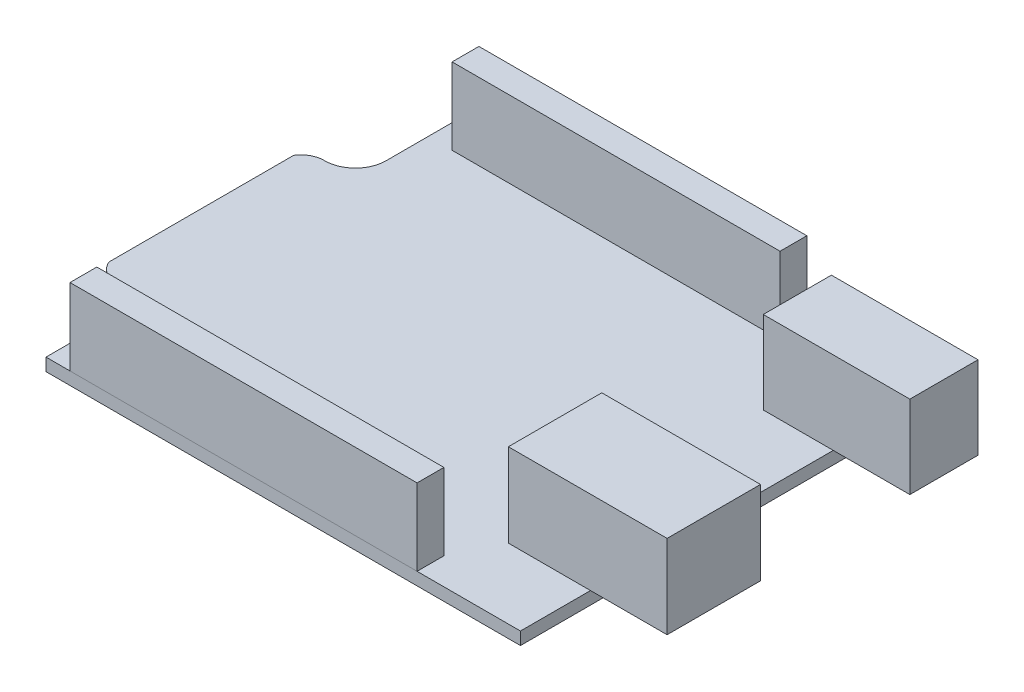
ISO-10303-21;
HEADER;
FILE_DESCRIPTION(('STEP AP214'),'2;1');
FILE_NAME('part.step','',(''),(''),'','','');
FILE_SCHEMA(('AUTOMOTIVE_DESIGN { 1 0 10303 214 1 1 1 1 }'));
ENDSEC;
DATA;
#1=APPLICATION_CONTEXT('core data for automotive mechanical design processes');
#2=APPLICATION_PROTOCOL_DEFINITION('international standard','automotive_design',2000,#1);
#3=PRODUCT_CONTEXT('',#1,'mechanical');
#4=PRODUCT('Part','Part','',(#3));
#5=PRODUCT_RELATED_PRODUCT_CATEGORY('part','',(#4));
#6=PRODUCT_DEFINITION_FORMATION('','',#4);
#7=PRODUCT_DEFINITION_CONTEXT('part definition',#1,'design');
#8=PRODUCT_DEFINITION('design','',#6,#7);
#9=PRODUCT_DEFINITION_SHAPE('','',#8);
#10=(LENGTH_UNIT() NAMED_UNIT(*) SI_UNIT(.MILLI.,.METRE.));
#11=(NAMED_UNIT(*) PLANE_ANGLE_UNIT() SI_UNIT($,.RADIAN.));
#12=(NAMED_UNIT(*) SI_UNIT($,.STERADIAN.) SOLID_ANGLE_UNIT());
#13=UNCERTAINTY_MEASURE_WITH_UNIT(LENGTH_MEASURE(1.E-05),#10,'distance_accuracy_value','');
#14=(GEOMETRIC_REPRESENTATION_CONTEXT(3) GLOBAL_UNCERTAINTY_ASSIGNED_CONTEXT((#13)) GLOBAL_UNIT_ASSIGNED_CONTEXT((#10,
#11,#12)) REPRESENTATION_CONTEXT('',''));
#15=CARTESIAN_POINT('',(0.,0.,0.));
#16=DIRECTION('',(0.,0.,1.));
#17=DIRECTION('',(1.,0.,0.));
#18=AXIS2_PLACEMENT_3D('',#15,#16,#17);
#19=CARTESIAN_POINT('',(20.8,1.65,26.7));
#20=DIRECTION('',(0.,0.,1.));
#21=DIRECTION('',(1.,0.,0.));
#22=AXIS2_PLACEMENT_3D('',#19,#20,#21);
#23=PLANE('',#22);
#24=DIRECTION('',(1.,0.,0.));
#25=VECTOR('',#24,1.);
#26=CARTESIAN_POINT('',(20.8,11.65,26.7));
#27=LINE('',#26,#25);
#28=CARTESIAN_POINT('',(-24.5218941319214,11.65,26.7));
#29=VERTEX_POINT('',#28);
#30=CARTESIAN_POINT('',(20.8,11.65,26.7));
#31=VERTEX_POINT('',#30);
#32=EDGE_CURVE('E115',#29,#31,#27,.T.);
#33=ORIENTED_EDGE('',*,*,#32,.F.);
#34=DIRECTION('',(0.,1.,0.));
#35=VECTOR('',#34,1.);
#36=CARTESIAN_POINT('',(-24.5218941319214,1.65,26.7));
#37=LINE('',#36,#35);
#38=CARTESIAN_POINT('',(-24.5218941319214,1.65,26.7));
#39=VERTEX_POINT('',#38);
#40=EDGE_CURVE('E12',#39,#29,#37,.T.);
#41=ORIENTED_EDGE('',*,*,#40,.F.);
#42=DIRECTION('',(1.,0.,0.));
#43=VECTOR('',#42,1.);
#44=CARTESIAN_POINT('',(20.8,1.65,26.7));
#45=LINE('',#44,#43);
#46=CARTESIAN_POINT('',(20.8,1.65,26.7));
#47=VERTEX_POINT('',#46);
#48=EDGE_CURVE('E109',#39,#47,#45,.T.);
#49=ORIENTED_EDGE('',*,*,#48,.T.);
#50=DIRECTION('',(0.,1.,0.));
#51=VECTOR('',#50,1.);
#52=CARTESIAN_POINT('',(20.8,1.65,26.7));
#53=LINE('',#52,#51);
#54=EDGE_CURVE('E54',#47,#31,#53,.T.);
#55=ORIENTED_EDGE('',*,*,#54,.T.);
#56=EDGE_LOOP('',(#33,#41,#49,#55));
#57=FACE_BOUND('',#56,.T.);
#58=ADVANCED_FACE('F51',(#57),#23,.T.);
#59=CARTESIAN_POINT('',(-24.5218941319214,1.65,23.1968694004578));
#60=DIRECTION('',(-1.,0.,0.));
#61=DIRECTION('',(0.,0.,1.));
#62=AXIS2_PLACEMENT_3D('',#59,#60,#61);
#63=PLANE('',#62);
#64=DIRECTION('',(0.,0.,1.));
#65=VECTOR('',#64,1.);
#66=CARTESIAN_POINT('',(-24.5218941319214,11.65,23.1968694004578));
#67=LINE('',#66,#65);
#68=CARTESIAN_POINT('',(-24.5218941319214,11.65,23.1968694004578));
#69=VERTEX_POINT('',#68);
#70=EDGE_CURVE('E111',#69,#29,#67,.T.);
#71=ORIENTED_EDGE('',*,*,#70,.F.);
#72=DIRECTION('',(0.,1.,0.));
#73=VECTOR('',#72,1.);
#74=CARTESIAN_POINT('',(-24.5218941319214,1.65,23.1968694004578));
#75=LINE('',#74,#73);
#76=CARTESIAN_POINT('',(-24.5218941319214,1.65,23.1968694004578));
#77=VERTEX_POINT('',#76);
#78=EDGE_CURVE('E60',#77,#69,#75,.T.);
#79=ORIENTED_EDGE('',*,*,#78,.F.);
#80=DIRECTION('',(0.,0.,1.));
#81=VECTOR('',#80,1.);
#82=CARTESIAN_POINT('',(-24.5218941319214,1.65,23.1968694004578));
#83=LINE('',#82,#81);
#84=EDGE_CURVE('E106',#77,#39,#83,.T.);
#85=ORIENTED_EDGE('',*,*,#84,.T.);
#86=ORIENTED_EDGE('',*,*,#40,.T.);
#87=EDGE_LOOP('',(#71,#79,#85,#86));
#88=FACE_BOUND('',#87,.T.);
#89=ADVANCED_FACE('F125',(#88),#63,.T.);
#90=CARTESIAN_POINT('',(-24.5218941319214,1.65,23.1968694004578));
#91=DIRECTION('',(0.,0.,-1.));
#92=DIRECTION('',(-1.,0.,0.));
#93=AXIS2_PLACEMENT_3D('',#90,#91,#92);
#94=PLANE('',#93);
#95=DIRECTION('',(-1.,0.,0.));
#96=VECTOR('',#95,1.);
#97=CARTESIAN_POINT('',(-24.5218941319214,11.65,23.1968694004578));
#98=LINE('',#97,#96);
#99=CARTESIAN_POINT('',(20.8,11.65,23.1968694004578));
#100=VERTEX_POINT('',#99);
#101=EDGE_CURVE('E101',#100,#69,#98,.T.);
#102=ORIENTED_EDGE('',*,*,#101,.F.);
#103=DIRECTION('',(0.,1.,0.));
#104=VECTOR('',#103,1.);
#105=CARTESIAN_POINT('',(20.8,1.65,23.1968694004578));
#106=LINE('',#105,#104);
#107=CARTESIAN_POINT('',(20.8,1.65,23.1968694004578));
#108=VERTEX_POINT('',#107);
#109=EDGE_CURVE('E96',#108,#100,#106,.T.);
#110=ORIENTED_EDGE('',*,*,#109,.F.);
#111=DIRECTION('',(-1.,0.,0.));
#112=VECTOR('',#111,1.);
#113=CARTESIAN_POINT('',(-24.5218941319214,1.65,23.1968694004578));
#114=LINE('',#113,#112);
#115=EDGE_CURVE('E99',#108,#77,#114,.T.);
#116=ORIENTED_EDGE('',*,*,#115,.T.);
#117=ORIENTED_EDGE('',*,*,#78,.T.);
#118=EDGE_LOOP('',(#102,#110,#116,#117));
#119=FACE_BOUND('',#118,.T.);
#120=ADVANCED_FACE('F98',(#119),#94,.T.);
#121=CARTESIAN_POINT('',(20.8,1.65,23.1968694004578));
#122=DIRECTION('',(1.,0.,0.));
#123=DIRECTION('',(0.,0.,-1.));
#124=AXIS2_PLACEMENT_3D('',#121,#122,#123);
#125=PLANE('',#124);
#126=DIRECTION('',(0.,0.,-1.));
#127=VECTOR('',#126,1.);
#128=CARTESIAN_POINT('',(20.8,11.65,23.1968694004578));
#129=LINE('',#128,#127);
#130=EDGE_CURVE('E118',#31,#100,#129,.T.);
#131=ORIENTED_EDGE('',*,*,#130,.F.);
#132=ORIENTED_EDGE('',*,*,#54,.F.);
#133=DIRECTION('',(0.,0.,-1.));
#134=VECTOR('',#133,1.);
#135=CARTESIAN_POINT('',(20.8,1.65,23.1968694004578));
#136=LINE('',#135,#134);
#137=EDGE_CURVE('E105',#47,#108,#136,.T.);
#138=ORIENTED_EDGE('',*,*,#137,.T.);
#139=ORIENTED_EDGE('',*,*,#109,.T.);
#140=EDGE_LOOP('',(#131,#132,#138,#139));
#141=FACE_BOUND('',#140,.T.);
#142=ADVANCED_FACE('F108',(#141),#125,.T.);
#143=CARTESIAN_POINT('',(0.,1.65,0.));
#144=DIRECTION('',(0.,1.,0.));
#145=DIRECTION('',(0.,0.,1.));
#146=AXIS2_PLACEMENT_3D('',#143,#144,#145);
#147=PLANE('',#146);
#148=ORIENTED_EDGE('',*,*,#48,.F.);
#149=ORIENTED_EDGE('',*,*,#84,.F.);
#150=ORIENTED_EDGE('',*,*,#115,.F.);
#151=ORIENTED_EDGE('',*,*,#137,.F.);
#152=EDGE_LOOP('',(#148,#149,#150,#151));
#153=FACE_BOUND('',#152,.T.);
#154=ADVANCED_FACE('F104',(#153),#147,.F.);
#155=CARTESIAN_POINT('',(0.,11.65,0.));
#156=DIRECTION('',(0.,1.,0.));
#157=DIRECTION('',(0.,0.,1.));
#158=AXIS2_PLACEMENT_3D('',#155,#156,#157);
#159=PLANE('',#158);
#160=ORIENTED_EDGE('',*,*,#32,.T.);
#161=ORIENTED_EDGE('',*,*,#130,.T.);
#162=ORIENTED_EDGE('',*,*,#101,.T.);
#163=ORIENTED_EDGE('',*,*,#70,.T.);
#164=EDGE_LOOP('',(#160,#161,#162,#163));
#165=FACE_BOUND('',#164,.T.);
#166=ADVANCED_FACE('F124',(#165),#159,.T.);
#167=CLOSED_SHELL('',(#58,#89,#120,#142,#154,#166));
#168=MANIFOLD_SOLID_BREP('B2',#167);
#169=CARTESIAN_POINT('',(-24.5218941319214,1.65,-26.7));
#170=DIRECTION('',(0.,0.,-1.));
#171=DIRECTION('',(-1.,0.,0.));
#172=AXIS2_PLACEMENT_3D('',#169,#170,#171);
#173=PLANE('',#172);
#174=DIRECTION('',(-1.,0.,0.));
#175=VECTOR('',#174,1.);
#176=CARTESIAN_POINT('',(-24.5218941319214,11.65,-26.7));
#177=LINE('',#176,#175);
#178=CARTESIAN_POINT('',(18.3,11.65,-26.7));
#179=VERTEX_POINT('',#178);
#180=CARTESIAN_POINT('',(-24.5218941319214,11.65,-26.7));
#181=VERTEX_POINT('',#180);
#182=EDGE_CURVE('E247',#179,#181,#177,.T.);
#183=ORIENTED_EDGE('',*,*,#182,.F.);
#184=DIRECTION('',(0.,1.,0.));
#185=VECTOR('',#184,1.);
#186=CARTESIAN_POINT('',(18.3,1.65,-26.7));
#187=LINE('',#186,#185);
#188=CARTESIAN_POINT('',(18.3,1.65,-26.7));
#189=VERTEX_POINT('',#188);
#190=EDGE_CURVE('E49',#189,#179,#187,.T.);
#191=ORIENTED_EDGE('',*,*,#190,.F.);
#192=DIRECTION('',(-1.,0.,0.));
#193=VECTOR('',#192,1.);
#194=CARTESIAN_POINT('',(-24.5218941319214,1.65,-26.7));
#195=LINE('',#194,#193);
#196=CARTESIAN_POINT('',(-24.5218941319214,1.65,-26.7));
#197=VERTEX_POINT('',#196);
#198=EDGE_CURVE('E241',#189,#197,#195,.T.);
#199=ORIENTED_EDGE('',*,*,#198,.T.);
#200=DIRECTION('',(0.,1.,0.));
#201=VECTOR('',#200,1.);
#202=CARTESIAN_POINT('',(-24.5218941319214,1.65,-26.7));
#203=LINE('',#202,#201);
#204=EDGE_CURVE('E186',#197,#181,#203,.T.);
#205=ORIENTED_EDGE('',*,*,#204,.T.);
#206=EDGE_LOOP('',(#183,#191,#199,#205));
#207=FACE_BOUND('',#206,.T.);
#208=ADVANCED_FACE('F183',(#207),#173,.T.);
#209=CARTESIAN_POINT('',(18.3,1.65,-23.1991943279057));
#210=DIRECTION('',(1.,0.,0.));
#211=DIRECTION('',(0.,0.,-1.));
#212=AXIS2_PLACEMENT_3D('',#209,#210,#211);
#213=PLANE('',#212);
#214=DIRECTION('',(0.,0.,-1.));
#215=VECTOR('',#214,1.);
#216=CARTESIAN_POINT('',(18.3,11.65,-23.1991943279057));
#217=LINE('',#216,#215);
#218=CARTESIAN_POINT('',(18.3,11.65,-23.1991943279057));
#219=VERTEX_POINT('',#218);
#220=EDGE_CURVE('E243',#219,#179,#217,.T.);
#221=ORIENTED_EDGE('',*,*,#220,.F.);
#222=DIRECTION('',(0.,1.,0.));
#223=VECTOR('',#222,1.);
#224=CARTESIAN_POINT('',(18.3,1.65,-23.1991943279057));
#225=LINE('',#224,#223);
#226=CARTESIAN_POINT('',(18.3,1.65,-23.1991943279057));
#227=VERTEX_POINT('',#226);
#228=EDGE_CURVE('E192',#227,#219,#225,.T.);
#229=ORIENTED_EDGE('',*,*,#228,.F.);
#230=DIRECTION('',(0.,0.,-1.));
#231=VECTOR('',#230,1.);
#232=CARTESIAN_POINT('',(18.3,1.65,-23.1991943279057));
#233=LINE('',#232,#231);
#234=EDGE_CURVE('E238',#227,#189,#233,.T.);
#235=ORIENTED_EDGE('',*,*,#234,.T.);
#236=ORIENTED_EDGE('',*,*,#190,.T.);
#237=EDGE_LOOP('',(#221,#229,#235,#236));
#238=FACE_BOUND('',#237,.T.);
#239=ADVANCED_FACE('F257',(#238),#213,.T.);
#240=CARTESIAN_POINT('',(18.3,1.65,-23.1991943279057));
#241=DIRECTION('',(0.,0.,1.));
#242=DIRECTION('',(1.,0.,0.));
#243=AXIS2_PLACEMENT_3D('',#240,#241,#242);
#244=PLANE('',#243);
#245=DIRECTION('',(1.,0.,0.));
#246=VECTOR('',#245,1.);
#247=CARTESIAN_POINT('',(18.3,11.65,-23.1991943279057));
#248=LINE('',#247,#246);
#249=CARTESIAN_POINT('',(-24.5218941319214,11.65,-23.1991943279057));
#250=VERTEX_POINT('',#249);
#251=EDGE_CURVE('E233',#250,#219,#248,.T.);
#252=ORIENTED_EDGE('',*,*,#251,.F.);
#253=DIRECTION('',(0.,1.,0.));
#254=VECTOR('',#253,1.);
#255=CARTESIAN_POINT('',(-24.5218941319214,1.65,-23.1991943279057));
#256=LINE('',#255,#254);
#257=CARTESIAN_POINT('',(-24.5218941319214,1.65,-23.1991943279057));
#258=VERTEX_POINT('',#257);
#259=EDGE_CURVE('E228',#258,#250,#256,.T.);
#260=ORIENTED_EDGE('',*,*,#259,.F.);
#261=DIRECTION('',(1.,0.,0.));
#262=VECTOR('',#261,1.);
#263=CARTESIAN_POINT('',(18.3,1.65,-23.1991943279057));
#264=LINE('',#263,#262);
#265=EDGE_CURVE('E231',#258,#227,#264,.T.);
#266=ORIENTED_EDGE('',*,*,#265,.T.);
#267=ORIENTED_EDGE('',*,*,#228,.T.);
#268=EDGE_LOOP('',(#252,#260,#266,#267));
#269=FACE_BOUND('',#268,.T.);
#270=ADVANCED_FACE('F230',(#269),#244,.T.);
#271=CARTESIAN_POINT('',(-24.5218941319214,1.65,-23.1991943279057));
#272=DIRECTION('',(-1.,0.,0.));
#273=DIRECTION('',(0.,0.,1.));
#274=AXIS2_PLACEMENT_3D('',#271,#272,#273);
#275=PLANE('',#274);
#276=DIRECTION('',(0.,0.,1.));
#277=VECTOR('',#276,1.);
#278=CARTESIAN_POINT('',(-24.5218941319214,11.65,-23.1991943279057));
#279=LINE('',#278,#277);
#280=EDGE_CURVE('E250',#181,#250,#279,.T.);
#281=ORIENTED_EDGE('',*,*,#280,.F.);
#282=ORIENTED_EDGE('',*,*,#204,.F.);
#283=DIRECTION('',(0.,0.,1.));
#284=VECTOR('',#283,1.);
#285=CARTESIAN_POINT('',(-24.5218941319214,1.65,-23.1991943279057));
#286=LINE('',#285,#284);
#287=EDGE_CURVE('E237',#197,#258,#286,.T.);
#288=ORIENTED_EDGE('',*,*,#287,.T.);
#289=ORIENTED_EDGE('',*,*,#259,.T.);
#290=EDGE_LOOP('',(#281,#282,#288,#289));
#291=FACE_BOUND('',#290,.T.);
#292=ADVANCED_FACE('F240',(#291),#275,.T.);
#293=CARTESIAN_POINT('',(0.,1.65,0.));
#294=DIRECTION('',(0.,1.,0.));
#295=DIRECTION('',(0.,0.,1.));
#296=AXIS2_PLACEMENT_3D('',#293,#294,#295);
#297=PLANE('',#296);
#298=ORIENTED_EDGE('',*,*,#198,.F.);
#299=ORIENTED_EDGE('',*,*,#234,.F.);
#300=ORIENTED_EDGE('',*,*,#265,.F.);
#301=ORIENTED_EDGE('',*,*,#287,.F.);
#302=EDGE_LOOP('',(#298,#299,#300,#301));
#303=FACE_BOUND('',#302,.T.);
#304=ADVANCED_FACE('F236',(#303),#297,.F.);
#305=CARTESIAN_POINT('',(0.,11.65,0.));
#306=DIRECTION('',(0.,1.,0.));
#307=DIRECTION('',(0.,0.,1.));
#308=AXIS2_PLACEMENT_3D('',#305,#306,#307);
#309=PLANE('',#308);
#310=ORIENTED_EDGE('',*,*,#182,.T.);
#311=ORIENTED_EDGE('',*,*,#280,.T.);
#312=ORIENTED_EDGE('',*,*,#251,.T.);
#313=ORIENTED_EDGE('',*,*,#220,.T.);
#314=EDGE_LOOP('',(#310,#311,#312,#313));
#315=FACE_BOUND('',#314,.T.);
#316=ADVANCED_FACE('F256',(#315),#309,.T.);
#317=CLOSED_SHELL('',(#208,#239,#270,#292,#304,#316));
#318=MANIFOLD_SOLID_BREP('B6',#317);
#319=CARTESIAN_POINT('',(34.3,11.65,26.7));
#320=DIRECTION('',(-1.,0.,0.));
#321=DIRECTION('',(0.,0.,1.));
#322=AXIS2_PLACEMENT_3D('',#319,#320,#321);
#323=PLANE('',#322);
#324=DIRECTION('',(0.,0.,-1.));
#325=VECTOR('',#324,1.);
#326=CARTESIAN_POINT('',(34.3,1.65,-14.15));
#327=LINE('',#326,#325);
#328=CARTESIAN_POINT('',(34.3,1.65,-14.15));
#329=VERTEX_POINT('',#328);
#330=CARTESIAN_POINT('',(34.3,1.65,-23.05));
#331=VERTEX_POINT('',#330);
#332=EDGE_CURVE('E464',#329,#331,#327,.T.);
#333=ORIENTED_EDGE('',*,*,#332,.F.);
#334=DIRECTION('',(0.,0.,-1.));
#335=VECTOR('',#334,1.);
#336=CARTESIAN_POINT('',(34.3,1.65,26.7));
#337=LINE('',#336,#335);
#338=CARTESIAN_POINT('',(34.3,1.65,5.35));
#339=VERTEX_POINT('',#338);
#340=EDGE_CURVE('E568',#339,#329,#337,.T.);
#341=ORIENTED_EDGE('',*,*,#340,.F.);
#342=DIRECTION('',(0.,0.,-1.));
#343=VECTOR('',#342,1.);
#344=CARTESIAN_POINT('',(34.3,1.65,17.55));
#345=LINE('',#344,#343);
#346=CARTESIAN_POINT('',(34.3,1.65,17.55));
#347=VERTEX_POINT('',#346);
#348=EDGE_CURVE('E503',#347,#339,#345,.T.);
#349=ORIENTED_EDGE('',*,*,#348,.F.);
#350=CARTESIAN_POINT('',(34.3,1.65,26.7));
#351=VERTEX_POINT('',#350);
#352=EDGE_CURVE('E564',#351,#347,#337,.T.);
#353=ORIENTED_EDGE('',*,*,#352,.F.);
#354=DIRECTION('',(0.,-1.,0.));
#355=VECTOR('',#354,1.);
#356=CARTESIAN_POINT('',(34.3,11.65,26.7));
#357=LINE('',#356,#355);
#358=CARTESIAN_POINT('',(34.3,0.,26.7));
#359=VERTEX_POINT('',#358);
#360=EDGE_CURVE('E314',#351,#359,#357,.T.);
#361=ORIENTED_EDGE('',*,*,#360,.T.);
#362=DIRECTION('',(0.,0.,-1.));
#363=VECTOR('',#362,1.);
#364=CARTESIAN_POINT('',(34.3,0.,26.7));
#365=LINE('',#364,#363);
#366=CARTESIAN_POINT('',(34.3,0.,-26.7));
#367=VERTEX_POINT('',#366);
#368=EDGE_CURVE('E605',#359,#367,#365,.T.);
#369=ORIENTED_EDGE('',*,*,#368,.T.);
#370=DIRECTION('',(0.,-1.,0.));
#371=VECTOR('',#370,1.);
#372=CARTESIAN_POINT('',(34.3,11.65,-26.7));
#373=LINE('',#372,#371);
#374=CARTESIAN_POINT('',(34.3,1.65,-26.7));
#375=VERTEX_POINT('',#374);
#376=EDGE_CURVE('E181',#375,#367,#373,.T.);
#377=ORIENTED_EDGE('',*,*,#376,.F.);
#378=EDGE_CURVE('E563',#331,#375,#337,.T.);
#379=ORIENTED_EDGE('',*,*,#378,.F.);
#380=EDGE_LOOP('',(#333,#341,#349,#353,#361,#369,#377,#379));
#381=FACE_BOUND('',#380,.T.);
#382=ADVANCED_FACE('F306',(#381),#323,.F.);
#383=CARTESIAN_POINT('',(-31.6543159783671,1.65,17.7));
#384=DIRECTION('',(0.,1.,0.));
#385=DIRECTION('',(0.,0.,1.));
#386=AXIS2_PLACEMENT_3D('',#383,#384,#385);
#387=PLANE('',#386);
#388=ORIENTED_EDGE('',*,*,#340,.T.);
#389=DIRECTION('',(1.,0.,0.));
#390=VECTOR('',#389,1.);
#391=CARTESIAN_POINT('',(25.1581012756503,1.65,-14.15));
#392=LINE('',#391,#390);
#393=CARTESIAN_POINT('',(25.1581012756503,1.65,-14.15));
#394=VERTEX_POINT('',#393);
#395=EDGE_CURVE('E469',#394,#329,#392,.T.);
#396=ORIENTED_EDGE('',*,*,#395,.F.);
#397=DIRECTION('',(0.,0.,1.));
#398=VECTOR('',#397,1.);
#399=CARTESIAN_POINT('',(25.1581012756503,1.65,-14.15));
#400=LINE('',#399,#398);
#401=CARTESIAN_POINT('',(25.1581012756503,1.65,-23.05));
#402=VERTEX_POINT('',#401);
#403=EDGE_CURVE('E472',#402,#394,#400,.T.);
#404=ORIENTED_EDGE('',*,*,#403,.F.);
#405=DIRECTION('',(-1.,0.,0.));
#406=VECTOR('',#405,1.);
#407=CARTESIAN_POINT('',(25.1581012756503,1.65,-23.05));
#408=LINE('',#407,#406);
#409=EDGE_CURVE('E486',#331,#402,#408,.T.);
#410=ORIENTED_EDGE('',*,*,#409,.F.);
#411=ORIENTED_EDGE('',*,*,#378,.T.);
#412=DIRECTION('',(-1.,0.,0.));
#413=VECTOR('',#412,1.);
#414=CARTESIAN_POINT('',(34.3,1.65,-26.7));
#415=LINE('',#414,#413);
#416=CARTESIAN_POINT('',(-27.6543159783671,1.65,-26.7));
#417=VERTEX_POINT('',#416);
#418=EDGE_CURVE('E567',#375,#417,#415,.T.);
#419=ORIENTED_EDGE('',*,*,#418,.T.);
#420=DIRECTION('',(0.,0.,1.));
#421=VECTOR('',#420,1.);
#422=CARTESIAN_POINT('',(-27.6543159783671,1.65,-26.7));
#423=LINE('',#422,#421);
#424=CARTESIAN_POINT('',(-27.6543159783671,1.65,-17.7));
#425=VERTEX_POINT('',#424);
#426=EDGE_CURVE('E571',#417,#425,#423,.T.);
#427=ORIENTED_EDGE('',*,*,#426,.T.);
#428=CARTESIAN_POINT('',(-31.6543159783671,1.65,-17.7));
#429=DIRECTION('',(0.,-1.,0.));
#430=DIRECTION('',(0.,0.,1.));
#431=AXIS2_PLACEMENT_3D('',#428,#429,#430);
#432=CIRCLE('',#431,4.);
#433=CARTESIAN_POINT('',(-31.7085963820042,1.65,-13.7003683122341));
#434=VERTEX_POINT('',#433);
#435=EDGE_CURVE('E574',#425,#434,#432,.T.);
#436=ORIENTED_EDGE('',*,*,#435,.T.);
#437=CARTESIAN_POINT('',(-31.749306684732,1.65,-10.7006445464097));
#438=DIRECTION('',(0.,1.,0.));
#439=DIRECTION('',(0.,0.,1.));
#440=AXIS2_PLACEMENT_3D('',#437,#438,#439);
#441=CIRCLE('',#440,3.);
#442=CARTESIAN_POINT('',(-34.3,1.65,-12.2798733491635));
#443=VERTEX_POINT('',#442);
#444=EDGE_CURVE('E577',#434,#443,#441,.T.);
#445=ORIENTED_EDGE('',*,*,#444,.T.);
#446=DIRECTION('',(0.,0.,1.));
#447=VECTOR('',#446,1.);
#448=CARTESIAN_POINT('',(-34.3,1.65,-12.2798733491635));
#449=LINE('',#448,#447);
#450=CARTESIAN_POINT('',(-34.3,1.65,11.8216019321234));
#451=VERTEX_POINT('',#450);
#452=EDGE_CURVE('E580',#443,#451,#449,.T.);
#453=ORIENTED_EDGE('',*,*,#452,.T.);
#454=CARTESIAN_POINT('',(-31.5170109007367,1.65,10.7013467498627));
#455=DIRECTION('',(0.,1.,0.));
#456=DIRECTION('',(0.,0.,1.));
#457=AXIS2_PLACEMENT_3D('',#454,#455,#456);
#458=CIRCLE('',#457,3.);
#459=CARTESIAN_POINT('',(-31.5758559340069,1.65,13.7007695713501));
#460=VERTEX_POINT('',#459);
#461=EDGE_CURVE('E583',#451,#460,#458,.T.);
#462=ORIENTED_EDGE('',*,*,#461,.T.);
#463=CARTESIAN_POINT('',(-31.6543159783671,1.65,17.7));
#464=DIRECTION('',(0.,-1.,0.));
#465=DIRECTION('',(0.,0.,1.));
#466=AXIS2_PLACEMENT_3D('',#463,#464,#465);
#467=CIRCLE('',#466,4.00000000000001);
#468=CARTESIAN_POINT('',(-27.6543159783671,1.65,17.7));
#469=VERTEX_POINT('',#468);
#470=EDGE_CURVE('E554',#460,#469,#467,.T.);
#471=ORIENTED_EDGE('',*,*,#470,.T.);
#472=DIRECTION('',(0.,0.,1.));
#473=VECTOR('',#472,1.);
#474=CARTESIAN_POINT('',(-27.6543159783671,1.65,17.7));
#475=LINE('',#474,#473);
#476=CARTESIAN_POINT('',(-27.6543159783671,1.65,26.7));
#477=VERTEX_POINT('',#476);
#478=EDGE_CURVE('E557',#469,#477,#475,.T.);
#479=ORIENTED_EDGE('',*,*,#478,.T.);
#480=DIRECTION('',(1.,0.,0.));
#481=VECTOR('',#480,1.);
#482=CARTESIAN_POINT('',(-27.6543159783671,1.65,26.7));
#483=LINE('',#482,#481);
#484=EDGE_CURVE('E560',#477,#351,#483,.T.);
#485=ORIENTED_EDGE('',*,*,#484,.T.);
#486=ORIENTED_EDGE('',*,*,#352,.T.);
#487=DIRECTION('',(1.,0.,0.));
#488=VECTOR('',#487,1.);
#489=CARTESIAN_POINT('',(23.5732072796395,1.65,17.55));
#490=LINE('',#489,#488);
#491=CARTESIAN_POINT('',(23.5732072796395,1.65,17.55));
#492=VERTEX_POINT('',#491);
#493=EDGE_CURVE('E326',#492,#347,#490,.T.);
#494=ORIENTED_EDGE('',*,*,#493,.F.);
#495=DIRECTION('',(0.,0.,1.));
#496=VECTOR('',#495,1.);
#497=CARTESIAN_POINT('',(23.5732072796395,1.65,17.55));
#498=LINE('',#497,#496);
#499=CARTESIAN_POINT('',(23.5732072796395,1.65,5.35));
#500=VERTEX_POINT('',#499);
#501=EDGE_CURVE('E321',#500,#492,#498,.T.);
#502=ORIENTED_EDGE('',*,*,#501,.F.);
#503=DIRECTION('',(-1.,0.,0.));
#504=VECTOR('',#503,1.);
#505=CARTESIAN_POINT('',(23.5732072796395,1.65,5.35));
#506=LINE('',#505,#504);
#507=EDGE_CURVE('E535',#339,#500,#506,.T.);
#508=ORIENTED_EDGE('',*,*,#507,.F.);
#509=EDGE_LOOP('',(#388,#396,#404,#410,#411,#419,#427,#436,#445,#453,#462,#471,#479,#485,#486,
#494,#502,#508));
#510=FACE_BOUND('',#509,.T.);
#511=ADVANCED_FACE('F678',(#510),#387,.T.);
#512=CARTESIAN_POINT('',(-34.3,11.65,-26.7));
#513=DIRECTION('',(0.,0.,1.));
#514=DIRECTION('',(1.,0.,0.));
#515=AXIS2_PLACEMENT_3D('',#512,#513,#514);
#516=PLANE('',#515);
#517=ORIENTED_EDGE('',*,*,#418,.F.);
#518=ORIENTED_EDGE('',*,*,#376,.T.);
#519=DIRECTION('',(-1.,0.,0.));
#520=VECTOR('',#519,1.);
#521=CARTESIAN_POINT('',(-34.3,0.,-26.7));
#522=LINE('',#521,#520);
#523=CARTESIAN_POINT('',(-27.6543159783671,0.,-26.7));
#524=VERTEX_POINT('',#523);
#525=EDGE_CURVE('E644',#367,#524,#522,.T.);
#526=ORIENTED_EDGE('',*,*,#525,.T.);
#527=DIRECTION('',(0.,1.,0.));
#528=VECTOR('',#527,1.);
#529=CARTESIAN_POINT('',(-27.6543159783671,0.,-26.7));
#530=LINE('',#529,#528);
#531=EDGE_CURVE('E628',#524,#417,#530,.T.);
#532=ORIENTED_EDGE('',*,*,#531,.T.);
#533=EDGE_LOOP('',(#517,#518,#526,#532));
#534=FACE_BOUND('',#533,.T.);
#535=ADVANCED_FACE('F673',(#534),#516,.F.);
#536=CARTESIAN_POINT('',(-34.3,11.65,26.7));
#537=DIRECTION('',(1.,0.,0.));
#538=DIRECTION('',(0.,0.,-1.));
#539=AXIS2_PLACEMENT_3D('',#536,#537,#538);
#540=PLANE('',#539);
#541=ORIENTED_EDGE('',*,*,#452,.F.);
#542=DIRECTION('',(0.,1.,0.));
#543=VECTOR('',#542,1.);
#544=CARTESIAN_POINT('',(-34.3,0.,-12.2798733491635));
#545=LINE('',#544,#543);
#546=CARTESIAN_POINT('',(-34.3,0.,-12.2798733491635));
#547=VERTEX_POINT('',#546);
#548=EDGE_CURVE('E624',#547,#443,#545,.T.);
#549=ORIENTED_EDGE('',*,*,#548,.F.);
#550=DIRECTION('',(0.,0.,1.));
#551=VECTOR('',#550,1.);
#552=CARTESIAN_POINT('',(-34.3,0.,26.7));
#553=LINE('',#552,#551);
#554=CARTESIAN_POINT('',(-34.3,0.,11.8216019321234));
#555=VERTEX_POINT('',#554);
#556=EDGE_CURVE('E648',#547,#555,#553,.T.);
#557=ORIENTED_EDGE('',*,*,#556,.T.);
#558=DIRECTION('',(0.,1.,0.));
#559=VECTOR('',#558,1.);
#560=CARTESIAN_POINT('',(-34.3,0.,11.8216019321234));
#561=LINE('',#560,#559);
#562=EDGE_CURVE('E610',#555,#451,#561,.T.);
#563=ORIENTED_EDGE('',*,*,#562,.T.);
#564=EDGE_LOOP('',(#541,#549,#557,#563));
#565=FACE_BOUND('',#564,.T.);
#566=ADVANCED_FACE('F716',(#565),#540,.F.);
#567=CARTESIAN_POINT('',(-34.3,11.65,26.7));
#568=DIRECTION('',(0.,0.,-1.));
#569=DIRECTION('',(-1.,0.,0.));
#570=AXIS2_PLACEMENT_3D('',#567,#568,#569);
#571=PLANE('',#570);
#572=ORIENTED_EDGE('',*,*,#484,.F.);
#573=DIRECTION('',(0.,1.,0.));
#574=VECTOR('',#573,1.);
#575=CARTESIAN_POINT('',(-27.6543159783671,0.,26.7));
#576=LINE('',#575,#574);
#577=CARTESIAN_POINT('',(-27.6543159783671,0.,26.7));
#578=VERTEX_POINT('',#577);
#579=EDGE_CURVE('E606',#578,#477,#576,.T.);
#580=ORIENTED_EDGE('',*,*,#579,.F.);
#581=DIRECTION('',(1.,0.,0.));
#582=VECTOR('',#581,1.);
#583=CARTESIAN_POINT('',(-34.3,0.,26.7));
#584=LINE('',#583,#582);
#585=EDGE_CURVE('E652',#578,#359,#584,.T.);
#586=ORIENTED_EDGE('',*,*,#585,.T.);
#587=ORIENTED_EDGE('',*,*,#360,.F.);
#588=EDGE_LOOP('',(#572,#580,#586,#587));
#589=FACE_BOUND('',#588,.T.);
#590=ADVANCED_FACE('F665',(#589),#571,.F.);
#591=CARTESIAN_POINT('',(-27.6543159783671,0.,-26.7));
#592=DIRECTION('',(-1.,0.,0.));
#593=DIRECTION('',(0.,0.,1.));
#594=AXIS2_PLACEMENT_3D('',#591,#592,#593);
#595=PLANE('',#594);
#596=DIRECTION('',(0.,1.,0.));
#597=VECTOR('',#596,1.);
#598=CARTESIAN_POINT('',(-27.6543159783671,0.,-17.7));
#599=LINE('',#598,#597);
#600=CARTESIAN_POINT('',(-27.6543159783671,0.,-17.7));
#601=VERTEX_POINT('',#600);
#602=EDGE_CURVE('E586',#601,#425,#599,.T.);
#603=ORIENTED_EDGE('',*,*,#602,.T.);
#604=ORIENTED_EDGE('',*,*,#426,.F.);
#605=ORIENTED_EDGE('',*,*,#531,.F.);
#606=DIRECTION('',(0.,0.,1.));
#607=VECTOR('',#606,1.);
#608=CARTESIAN_POINT('',(-27.6543159783671,0.,-26.7));
#609=LINE('',#608,#607);
#610=EDGE_CURVE('E592',#524,#601,#609,.T.);
#611=ORIENTED_EDGE('',*,*,#610,.T.);
#612=EDGE_LOOP('',(#603,#604,#605,#611));
#613=FACE_BOUND('',#612,.T.);
#614=ADVANCED_FACE('F732',(#613),#595,.T.);
#615=CARTESIAN_POINT('',(-31.6543159783671,0.,-17.7));
#616=DIRECTION('',(0.,1.,0.));
#617=DIRECTION('',(0.,0.,1.));
#618=AXIS2_PLACEMENT_3D('',#615,#616,#617);
#619=CYLINDRICAL_SURFACE('',#618,4.);
#620=DIRECTION('',(0.,1.,0.));
#621=VECTOR('',#620,1.);
#622=CARTESIAN_POINT('',(-31.7085963820042,0.,-13.7003683122341));
#623=LINE('',#622,#621);
#624=CARTESIAN_POINT('',(-31.7085963820042,0.,-13.7003683122341));
#625=VERTEX_POINT('',#624);
#626=EDGE_CURVE('E620',#625,#434,#623,.T.);
#627=ORIENTED_EDGE('',*,*,#626,.T.);
#628=ORIENTED_EDGE('',*,*,#435,.F.);
#629=ORIENTED_EDGE('',*,*,#602,.F.);
#630=CARTESIAN_POINT('',(-31.6543159783671,0.,-17.7));
#631=DIRECTION('',(0.,-1.,0.));
#632=DIRECTION('',(0.,0.,-1.));
#633=AXIS2_PLACEMENT_3D('',#630,#631,#632);
#634=CIRCLE('',#633,4.);
#635=EDGE_CURVE('E635',#601,#625,#634,.T.);
#636=ORIENTED_EDGE('',*,*,#635,.T.);
#637=EDGE_LOOP('',(#627,#628,#629,#636));
#638=FACE_BOUND('',#637,.T.);
#639=ADVANCED_FACE('F735',(#638),#619,.F.);
#640=CARTESIAN_POINT('',(-31.749306684732,0.,-10.7006445464097));
#641=DIRECTION('',(0.,1.,0.));
#642=DIRECTION('',(0.,0.,1.));
#643=AXIS2_PLACEMENT_3D('',#640,#641,#642);
#644=CYLINDRICAL_SURFACE('',#643,3.);
#645=ORIENTED_EDGE('',*,*,#548,.T.);
#646=ORIENTED_EDGE('',*,*,#444,.F.);
#647=ORIENTED_EDGE('',*,*,#626,.F.);
#648=CARTESIAN_POINT('',(-31.749306684732,0.,-10.7006445464097));
#649=DIRECTION('',(0.,1.,0.));
#650=DIRECTION('',(0.,0.,1.));
#651=AXIS2_PLACEMENT_3D('',#648,#649,#650);
#652=CIRCLE('',#651,3.);
#653=EDGE_CURVE('E632',#625,#547,#652,.T.);
#654=ORIENTED_EDGE('',*,*,#653,.T.);
#655=EDGE_LOOP('',(#645,#646,#647,#654));
#656=FACE_BOUND('',#655,.T.);
#657=ADVANCED_FACE('F730',(#656),#644,.T.);
#658=CARTESIAN_POINT('',(-31.6543159783671,0.,17.7));
#659=DIRECTION('',(0.,1.,0.));
#660=DIRECTION('',(0.,0.,1.));
#661=AXIS2_PLACEMENT_3D('',#658,#659,#660);
#662=CYLINDRICAL_SURFACE('',#661,4.);
#663=ORIENTED_EDGE('',*,*,#470,.F.);
#664=DIRECTION('',(0.,1.,0.));
#665=VECTOR('',#664,1.);
#666=CARTESIAN_POINT('',(-31.5758559340069,0.,13.7007695713501));
#667=LINE('',#666,#665);
#668=CARTESIAN_POINT('',(-31.5758559340069,0.,13.7007695713501));
#669=VERTEX_POINT('',#668);
#670=EDGE_CURVE('E600',#669,#460,#667,.T.);
#671=ORIENTED_EDGE('',*,*,#670,.F.);
#672=CARTESIAN_POINT('',(-31.6543159783671,0.,17.7));
#673=DIRECTION('',(0.,1.,0.));
#674=DIRECTION('',(0.,0.,1.));
#675=AXIS2_PLACEMENT_3D('',#672,#673,#674);
#676=CIRCLE('',#675,4.);
#677=CARTESIAN_POINT('',(-27.6543159783671,0.,17.7));
#678=VERTEX_POINT('',#677);
#679=EDGE_CURVE('E587',#678,#669,#676,.T.);
#680=ORIENTED_EDGE('',*,*,#679,.F.);
#681=DIRECTION('',(0.,1.,0.));
#682=VECTOR('',#681,1.);
#683=CARTESIAN_POINT('',(-27.6543159783671,0.,17.7));
#684=LINE('',#683,#682);
#685=EDGE_CURVE('E601',#678,#469,#684,.T.);
#686=ORIENTED_EDGE('',*,*,#685,.T.);
#687=EDGE_LOOP('',(#663,#671,#680,#686));
#688=FACE_BOUND('',#687,.T.);
#689=ADVANCED_FACE('F723',(#688),#662,.F.);
#690=CARTESIAN_POINT('',(-27.6543159783671,0.,0.));
#691=DIRECTION('',(1.,0.,0.));
#692=DIRECTION('',(0.,0.,-1.));
#693=AXIS2_PLACEMENT_3D('',#690,#691,#692);
#694=PLANE('',#693);
#695=ORIENTED_EDGE('',*,*,#478,.F.);
#696=ORIENTED_EDGE('',*,*,#685,.F.);
#697=DIRECTION('',(0.,0.,-1.));
#698=VECTOR('',#697,1.);
#699=CARTESIAN_POINT('',(-27.6543159783671,0.,0.));
#700=LINE('',#699,#698);
#701=EDGE_CURVE('E596',#578,#678,#700,.T.);
#702=ORIENTED_EDGE('',*,*,#701,.F.);
#703=ORIENTED_EDGE('',*,*,#579,.T.);
#704=EDGE_LOOP('',(#695,#696,#702,#703));
#705=FACE_BOUND('',#704,.T.);
#706=ADVANCED_FACE('F719',(#705),#694,.F.);
#707=CARTESIAN_POINT('',(-31.5170109007367,0.,10.7013467498627));
#708=DIRECTION('',(0.,1.,0.));
#709=DIRECTION('',(0.,0.,1.));
#710=AXIS2_PLACEMENT_3D('',#707,#708,#709);
#711=CYLINDRICAL_SURFACE('',#710,3.);
#712=ORIENTED_EDGE('',*,*,#461,.F.);
#713=ORIENTED_EDGE('',*,*,#562,.F.);
#714=CARTESIAN_POINT('',(-31.5170109007367,0.,10.7013467498627));
#715=DIRECTION('',(0.,1.,0.));
#716=DIRECTION('',(0.,0.,1.));
#717=AXIS2_PLACEMENT_3D('',#714,#715,#716);
#718=CIRCLE('',#717,3.);
#719=EDGE_CURVE('E591',#669,#555,#718,.F.);
#720=ORIENTED_EDGE('',*,*,#719,.F.);
#721=ORIENTED_EDGE('',*,*,#670,.T.);
#722=EDGE_LOOP('',(#712,#713,#720,#721));
#723=FACE_BOUND('',#722,.T.);
#724=ADVANCED_FACE('F722',(#723),#711,.T.);
#725=CARTESIAN_POINT('',(0.,0.,0.));
#726=DIRECTION('',(0.,-1.,0.));
#727=DIRECTION('',(0.,0.,-1.));
#728=AXIS2_PLACEMENT_3D('',#725,#726,#727);
#729=PLANE('',#728);
#730=ORIENTED_EDGE('',*,*,#701,.T.);
#731=ORIENTED_EDGE('',*,*,#679,.T.);
#732=ORIENTED_EDGE('',*,*,#719,.T.);
#733=ORIENTED_EDGE('',*,*,#556,.F.);
#734=ORIENTED_EDGE('',*,*,#653,.F.);
#735=ORIENTED_EDGE('',*,*,#635,.F.);
#736=ORIENTED_EDGE('',*,*,#610,.F.);
#737=ORIENTED_EDGE('',*,*,#525,.F.);
#738=ORIENTED_EDGE('',*,*,#368,.F.);
#739=ORIENTED_EDGE('',*,*,#585,.F.);
#740=EDGE_LOOP('',(#730,#731,#732,#733,#734,#735,#736,#737,#738,#739));
#741=FACE_BOUND('',#740,.T.);
#742=ADVANCED_FACE('F668',(#741),#729,.T.);
#743=CARTESIAN_POINT('',(23.5732072796395,12.55,17.55));
#744=DIRECTION('',(1.,0.,0.));
#745=DIRECTION('',(0.,0.,-1.));
#746=AXIS2_PLACEMENT_3D('',#743,#744,#745);
#747=PLANE('',#746);
#748=ORIENTED_EDGE('',*,*,#501,.T.);
#749=DIRECTION('',(0.,-1.,0.));
#750=VECTOR('',#749,1.);
#751=CARTESIAN_POINT('',(23.5732072796395,12.55,17.55));
#752=LINE('',#751,#750);
#753=CARTESIAN_POINT('',(23.5732072796395,12.55,17.55));
#754=VERTEX_POINT('',#753);
#755=EDGE_CURVE('E551',#754,#492,#752,.T.);
#756=ORIENTED_EDGE('',*,*,#755,.F.);
#757=DIRECTION('',(0.,0.,1.));
#758=VECTOR('',#757,1.);
#759=CARTESIAN_POINT('',(23.5732072796395,12.55,17.55));
#760=LINE('',#759,#758);
#761=CARTESIAN_POINT('',(23.5732072796395,12.55,5.35));
#762=VERTEX_POINT('',#761);
#763=EDGE_CURVE('E530',#762,#754,#760,.T.);
#764=ORIENTED_EDGE('',*,*,#763,.F.);
#765=DIRECTION('',(0.,-1.,0.));
#766=VECTOR('',#765,1.);
#767=CARTESIAN_POINT('',(23.5732072796395,12.55,5.35));
#768=LINE('',#767,#766);
#769=EDGE_CURVE('E541',#762,#500,#768,.T.);
#770=ORIENTED_EDGE('',*,*,#769,.T.);
#771=EDGE_LOOP('',(#748,#756,#764,#770));
#772=FACE_BOUND('',#771,.T.);
#773=ADVANCED_FACE('F697',(#772),#747,.F.);
#774=CARTESIAN_POINT('',(23.5732072796395,12.55,17.55));
#775=DIRECTION('',(0.,0.,-1.));
#776=DIRECTION('',(-1.,0.,0.));
#777=AXIS2_PLACEMENT_3D('',#774,#775,#776);
#778=PLANE('',#777);
#779=ORIENTED_EDGE('',*,*,#493,.T.);
#780=DIRECTION('',(-1.,0.,0.));
#781=VECTOR('',#780,1.);
#782=CARTESIAN_POINT('',(44.3,1.65,17.55));
#783=LINE('',#782,#781);
#784=CARTESIAN_POINT('',(44.3,1.65,17.55));
#785=VERTEX_POINT('',#784);
#786=EDGE_CURVE('E526',#785,#347,#783,.T.);
#787=ORIENTED_EDGE('',*,*,#786,.F.);
#788=DIRECTION('',(0.,-1.,0.));
#789=VECTOR('',#788,1.);
#790=CARTESIAN_POINT('',(44.3,12.55,17.55));
#791=LINE('',#790,#789);
#792=CARTESIAN_POINT('',(44.3,12.55,17.55));
#793=VERTEX_POINT('',#792);
#794=EDGE_CURVE('E504',#793,#785,#791,.T.);
#795=ORIENTED_EDGE('',*,*,#794,.F.);
#796=DIRECTION('',(1.,0.,0.));
#797=VECTOR('',#796,1.);
#798=CARTESIAN_POINT('',(23.5732072796395,12.55,17.55));
#799=LINE('',#798,#797);
#800=EDGE_CURVE('E534',#754,#793,#799,.T.);
#801=ORIENTED_EDGE('',*,*,#800,.F.);
#802=ORIENTED_EDGE('',*,*,#755,.T.);
#803=EDGE_LOOP('',(#779,#787,#795,#801,#802));
#804=FACE_BOUND('',#803,.T.);
#805=ADVANCED_FACE('F684',(#804),#778,.F.);
#806=CARTESIAN_POINT('',(23.5732072796395,12.55,5.35));
#807=DIRECTION('',(0.,0.,1.));
#808=DIRECTION('',(1.,0.,0.));
#809=AXIS2_PLACEMENT_3D('',#806,#807,#808);
#810=PLANE('',#809);
#811=ORIENTED_EDGE('',*,*,#507,.T.);
#812=ORIENTED_EDGE('',*,*,#769,.F.);
#813=DIRECTION('',(-1.,0.,0.));
#814=VECTOR('',#813,1.);
#815=CARTESIAN_POINT('',(23.5732072796395,12.55,5.35));
#816=LINE('',#815,#814);
#817=CARTESIAN_POINT('',(44.3,12.55,5.35));
#818=VERTEX_POINT('',#817);
#819=EDGE_CURVE('E538',#818,#762,#816,.T.);
#820=ORIENTED_EDGE('',*,*,#819,.F.);
#821=DIRECTION('',(0.,1.,0.));
#822=VECTOR('',#821,1.);
#823=CARTESIAN_POINT('',(44.3,12.55,5.35));
#824=LINE('',#823,#822);
#825=CARTESIAN_POINT('',(44.3,1.65,5.35));
#826=VERTEX_POINT('',#825);
#827=EDGE_CURVE('E511',#826,#818,#824,.T.);
#828=ORIENTED_EDGE('',*,*,#827,.F.);
#829=DIRECTION('',(-1.,0.,0.));
#830=VECTOR('',#829,1.);
#831=CARTESIAN_POINT('',(44.3,1.65,5.35));
#832=LINE('',#831,#830);
#833=EDGE_CURVE('E519',#826,#339,#832,.T.);
#834=ORIENTED_EDGE('',*,*,#833,.T.);
#835=EDGE_LOOP('',(#811,#812,#820,#828,#834));
#836=FACE_BOUND('',#835,.T.);
#837=ADVANCED_FACE('F699',(#836),#810,.F.);
#838=CARTESIAN_POINT('',(0.,12.55,0.));
#839=DIRECTION('',(0.,-1.,0.));
#840=DIRECTION('',(0.,0.,-1.));
#841=AXIS2_PLACEMENT_3D('',#838,#839,#840);
#842=PLANE('',#841);
#843=ORIENTED_EDGE('',*,*,#763,.T.);
#844=ORIENTED_EDGE('',*,*,#800,.T.);
#845=DIRECTION('',(0.,0.,1.));
#846=VECTOR('',#845,1.);
#847=CARTESIAN_POINT('',(44.3,12.55,17.55));
#848=LINE('',#847,#846);
#849=EDGE_CURVE('E515',#818,#793,#848,.T.);
#850=ORIENTED_EDGE('',*,*,#849,.F.);
#851=ORIENTED_EDGE('',*,*,#819,.T.);
#852=EDGE_LOOP('',(#843,#844,#850,#851));
#853=FACE_BOUND('',#852,.T.);
#854=ADVANCED_FACE('F694',(#853),#842,.F.);
#855=CARTESIAN_POINT('',(44.3,1.65,17.55));
#856=DIRECTION('',(0.,1.,0.));
#857=DIRECTION('',(0.,0.,1.));
#858=AXIS2_PLACEMENT_3D('',#855,#856,#857);
#859=PLANE('',#858);
#860=ORIENTED_EDGE('',*,*,#348,.T.);
#861=ORIENTED_EDGE('',*,*,#833,.F.);
#862=DIRECTION('',(0.,0.,-1.));
#863=VECTOR('',#862,1.);
#864=CARTESIAN_POINT('',(44.3,1.65,17.55));
#865=LINE('',#864,#863);
#866=EDGE_CURVE('E508',#785,#826,#865,.T.);
#867=ORIENTED_EDGE('',*,*,#866,.F.);
#868=ORIENTED_EDGE('',*,*,#786,.T.);
#869=EDGE_LOOP('',(#860,#861,#867,#868));
#870=FACE_BOUND('',#869,.T.);
#871=ADVANCED_FACE('F687',(#870),#859,.F.);
#872=CARTESIAN_POINT('',(44.3,0.,0.));
#873=DIRECTION('',(1.,0.,0.));
#874=DIRECTION('',(0.,0.,-1.));
#875=AXIS2_PLACEMENT_3D('',#872,#873,#874);
#876=PLANE('',#875);
#877=ORIENTED_EDGE('',*,*,#794,.T.);
#878=ORIENTED_EDGE('',*,*,#866,.T.);
#879=ORIENTED_EDGE('',*,*,#827,.T.);
#880=ORIENTED_EDGE('',*,*,#849,.T.);
#881=EDGE_LOOP('',(#877,#878,#879,#880));
#882=FACE_BOUND('',#881,.T.);
#883=ADVANCED_FACE('F690',(#882),#876,.T.);
#884=CARTESIAN_POINT('',(25.1581012756503,12.45,-14.15));
#885=DIRECTION('',(1.,0.,0.));
#886=DIRECTION('',(0.,0.,-1.));
#887=AXIS2_PLACEMENT_3D('',#884,#885,#886);
#888=PLANE('',#887);
#889=ORIENTED_EDGE('',*,*,#403,.T.);
#890=DIRECTION('',(0.,-1.,0.));
#891=VECTOR('',#890,1.);
#892=CARTESIAN_POINT('',(25.1581012756503,12.45,-14.15));
#893=LINE('',#892,#891);
#894=CARTESIAN_POINT('',(25.1581012756503,12.45,-14.15));
#895=VERTEX_POINT('',#894);
#896=EDGE_CURVE('E500',#895,#394,#893,.T.);
#897=ORIENTED_EDGE('',*,*,#896,.F.);
#898=DIRECTION('',(0.,0.,1.));
#899=VECTOR('',#898,1.);
#900=CARTESIAN_POINT('',(25.1581012756503,12.45,-14.15));
#901=LINE('',#900,#899);
#902=CARTESIAN_POINT('',(25.1581012756503,12.45,-23.05));
#903=VERTEX_POINT('',#902);
#904=EDGE_CURVE('E481',#903,#895,#901,.T.);
#905=ORIENTED_EDGE('',*,*,#904,.F.);
#906=DIRECTION('',(0.,-1.,0.));
#907=VECTOR('',#906,1.);
#908=CARTESIAN_POINT('',(25.1581012756503,12.45,-23.05));
#909=LINE('',#908,#907);
#910=EDGE_CURVE('E491',#903,#402,#909,.T.);
#911=ORIENTED_EDGE('',*,*,#910,.T.);
#912=EDGE_LOOP('',(#889,#897,#905,#911));
#913=FACE_BOUND('',#912,.T.);
#914=ADVANCED_FACE('F837',(#913),#888,.F.);
#915=CARTESIAN_POINT('',(25.1581012756503,12.45,-14.15));
#916=DIRECTION('',(0.,0.,-1.));
#917=DIRECTION('',(-1.,0.,0.));
#918=AXIS2_PLACEMENT_3D('',#915,#916,#917);
#919=PLANE('',#918);
#920=ORIENTED_EDGE('',*,*,#395,.T.);
#921=DIRECTION('',(-1.,0.,0.));
#922=VECTOR('',#921,1.);
#923=CARTESIAN_POINT('',(44.3,1.65,-14.15));
#924=LINE('',#923,#922);
#925=CARTESIAN_POINT('',(44.3,1.65,-14.15));
#926=VERTEX_POINT('',#925);
#927=EDGE_CURVE('E446',#926,#329,#924,.T.);
#928=ORIENTED_EDGE('',*,*,#927,.F.);
#929=DIRECTION('',(0.,-1.,0.));
#930=VECTOR('',#929,1.);
#931=CARTESIAN_POINT('',(44.3,12.45,-14.15));
#932=LINE('',#931,#930);
#933=CARTESIAN_POINT('',(44.3,12.45,-14.15));
#934=VERTEX_POINT('',#933);
#935=EDGE_CURVE('E455',#934,#926,#932,.T.);
#936=ORIENTED_EDGE('',*,*,#935,.F.);
#937=DIRECTION('',(1.,0.,0.));
#938=VECTOR('',#937,1.);
#939=CARTESIAN_POINT('',(25.1581012756503,12.45,-14.15));
#940=LINE('',#939,#938);
#941=EDGE_CURVE('E485',#895,#934,#940,.T.);
#942=ORIENTED_EDGE('',*,*,#941,.F.);
#943=ORIENTED_EDGE('',*,*,#896,.T.);
#944=EDGE_LOOP('',(#920,#928,#936,#942,#943));
#945=FACE_BOUND('',#944,.T.);
#946=ADVANCED_FACE('F467',(#945),#919,.F.);
#947=CARTESIAN_POINT('',(25.1581012756503,12.45,-23.05));
#948=DIRECTION('',(0.,0.,1.));
#949=DIRECTION('',(1.,0.,0.));
#950=AXIS2_PLACEMENT_3D('',#947,#948,#949);
#951=PLANE('',#950);
#952=ORIENTED_EDGE('',*,*,#409,.T.);
#953=ORIENTED_EDGE('',*,*,#910,.F.);
#954=DIRECTION('',(-1.,0.,0.));
#955=VECTOR('',#954,1.);
#956=CARTESIAN_POINT('',(25.1581012756503,12.45,-23.05));
#957=LINE('',#956,#955);
#958=CARTESIAN_POINT('',(44.3,12.45,-23.05));
#959=VERTEX_POINT('',#958);
#960=EDGE_CURVE('E489',#959,#903,#957,.T.);
#961=ORIENTED_EDGE('',*,*,#960,.F.);
#962=DIRECTION('',(0.,1.,0.));
#963=VECTOR('',#962,1.);
#964=CARTESIAN_POINT('',(44.3,12.45,-23.05));
#965=LINE('',#964,#963);
#966=CARTESIAN_POINT('',(44.3,1.65,-23.05));
#967=VERTEX_POINT('',#966);
#968=EDGE_CURVE('E454',#967,#959,#965,.T.);
#969=ORIENTED_EDGE('',*,*,#968,.F.);
#970=DIRECTION('',(-1.,0.,0.));
#971=VECTOR('',#970,1.);
#972=CARTESIAN_POINT('',(44.3,1.65,-23.05));
#973=LINE('',#972,#971);
#974=EDGE_CURVE('E449',#967,#331,#973,.T.);
#975=ORIENTED_EDGE('',*,*,#974,.T.);
#976=EDGE_LOOP('',(#952,#953,#961,#969,#975));
#977=FACE_BOUND('',#976,.T.);
#978=ADVANCED_FACE('F865',(#977),#951,.F.);
#979=CARTESIAN_POINT('',(0.,12.45,0.));
#980=DIRECTION('',(0.,-1.,0.));
#981=DIRECTION('',(0.,0.,-1.));
#982=AXIS2_PLACEMENT_3D('',#979,#980,#981);
#983=PLANE('',#982);
#984=ORIENTED_EDGE('',*,*,#904,.T.);
#985=ORIENTED_EDGE('',*,*,#941,.T.);
#986=DIRECTION('',(0.,0.,1.));
#987=VECTOR('',#986,1.);
#988=CARTESIAN_POINT('',(44.3,12.45,-14.15));
#989=LINE('',#988,#987);
#990=EDGE_CURVE('E461',#959,#934,#989,.T.);
#991=ORIENTED_EDGE('',*,*,#990,.F.);
#992=ORIENTED_EDGE('',*,*,#960,.T.);
#993=EDGE_LOOP('',(#984,#985,#991,#992));
#994=FACE_BOUND('',#993,.T.);
#995=ADVANCED_FACE('F874',(#994),#983,.F.);
#996=CARTESIAN_POINT('',(44.3,1.65,-14.15));
#997=DIRECTION('',(0.,1.,0.));
#998=DIRECTION('',(0.,0.,1.));
#999=AXIS2_PLACEMENT_3D('',#996,#997,#998);
#1000=PLANE('',#999);
#1001=ORIENTED_EDGE('',*,*,#332,.T.);
#1002=ORIENTED_EDGE('',*,*,#974,.F.);
#1003=DIRECTION('',(0.,0.,-1.));
#1004=VECTOR('',#1003,1.);
#1005=CARTESIAN_POINT('',(44.3,1.65,-14.15));
#1006=LINE('',#1005,#1004);
#1007=EDGE_CURVE('E442',#926,#967,#1006,.T.);
#1008=ORIENTED_EDGE('',*,*,#1007,.F.);
#1009=ORIENTED_EDGE('',*,*,#927,.T.);
#1010=EDGE_LOOP('',(#1001,#1002,#1008,#1009));
#1011=FACE_BOUND('',#1010,.T.);
#1012=ADVANCED_FACE('F444',(#1011),#1000,.F.);
#1013=CARTESIAN_POINT('',(44.3,0.,0.));
#1014=DIRECTION('',(1.,0.,0.));
#1015=DIRECTION('',(0.,0.,-1.));
#1016=AXIS2_PLACEMENT_3D('',#1013,#1014,#1015);
#1017=PLANE('',#1016);
#1018=ORIENTED_EDGE('',*,*,#935,.T.);
#1019=ORIENTED_EDGE('',*,*,#1007,.T.);
#1020=ORIENTED_EDGE('',*,*,#968,.T.);
#1021=ORIENTED_EDGE('',*,*,#990,.T.);
#1022=EDGE_LOOP('',(#1018,#1019,#1020,#1021));
#1023=FACE_BOUND('',#1022,.T.);
#1024=ADVANCED_FACE('F459',(#1023),#1017,.T.);
#1025=CLOSED_SHELL('',(#382,#511,#535,#566,#590,#614,#639,#657,#689,#706,#724,#742,#773,#805,
#837,#854,#871,#883,#914,#946,#978,#995,#1012,#1024));
#1026=MANIFOLD_SOLID_BREP('B43',#1025);
#1027=ADVANCED_BREP_SHAPE_REPRESENTATION('',(#18,#168,#318,#1026),#14);
#1028=SHAPE_DEFINITION_REPRESENTATION(#9,#1027);
ENDSEC;
END-ISO-10303-21;
